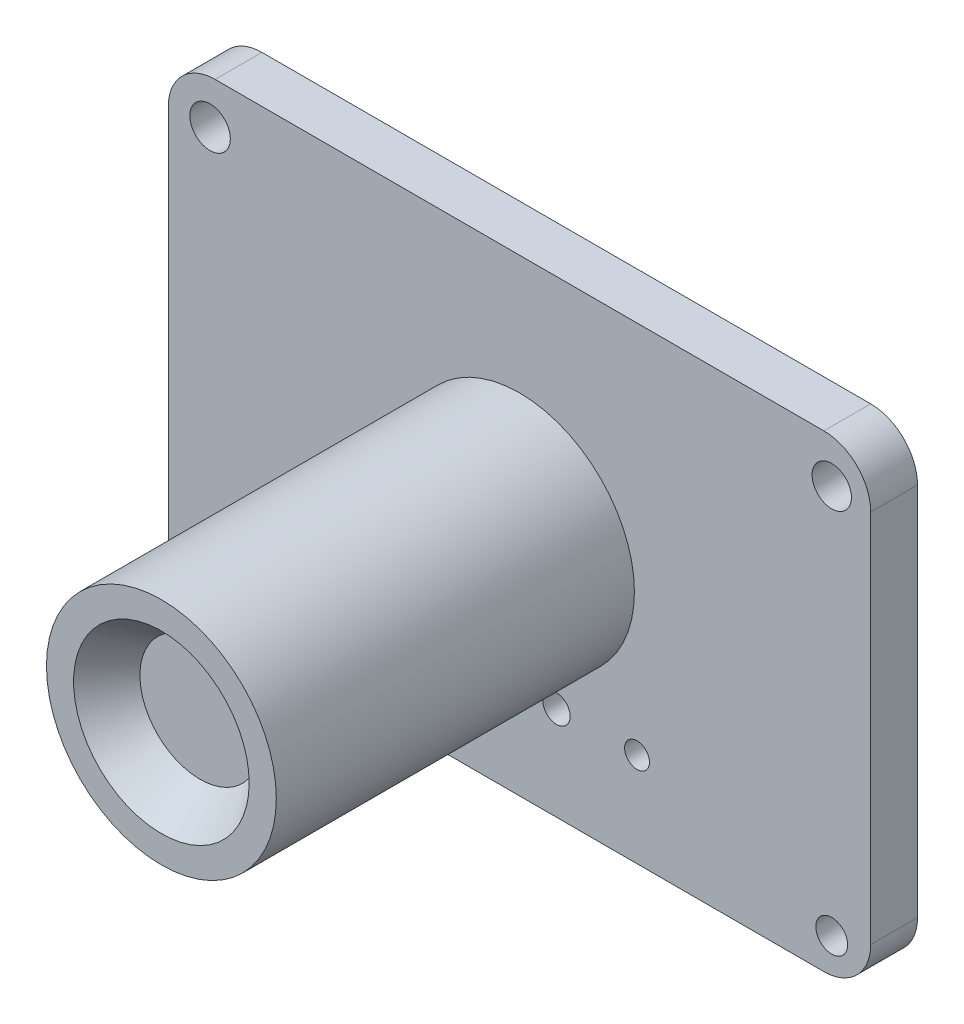
ISO-10303-21;
HEADER;
FILE_DESCRIPTION(('STEP AP214'),'2;1');
FILE_NAME('part.step','',(''),(''),'','','');
FILE_SCHEMA(('AUTOMOTIVE_DESIGN { 1 0 10303 214 1 1 1 1 }'));
ENDSEC;
DATA;
#1=APPLICATION_CONTEXT('core data for automotive mechanical design processes');
#2=APPLICATION_PROTOCOL_DEFINITION('international standard','automotive_design',2000,#1);
#3=PRODUCT_CONTEXT('',#1,'mechanical');
#4=PRODUCT('Part','Part','',(#3));
#5=PRODUCT_RELATED_PRODUCT_CATEGORY('part','',(#4));
#6=PRODUCT_DEFINITION_FORMATION('','',#4);
#7=PRODUCT_DEFINITION_CONTEXT('part definition',#1,'design');
#8=PRODUCT_DEFINITION('design','',#6,#7);
#9=PRODUCT_DEFINITION_SHAPE('','',#8);
#10=(LENGTH_UNIT() NAMED_UNIT(*) SI_UNIT(.MILLI.,.METRE.));
#11=(NAMED_UNIT(*) PLANE_ANGLE_UNIT() SI_UNIT($,.RADIAN.));
#12=(NAMED_UNIT(*) SI_UNIT($,.STERADIAN.) SOLID_ANGLE_UNIT());
#13=UNCERTAINTY_MEASURE_WITH_UNIT(LENGTH_MEASURE(1.E-05),#10,'distance_accuracy_value','');
#14=(GEOMETRIC_REPRESENTATION_CONTEXT(3) GLOBAL_UNCERTAINTY_ASSIGNED_CONTEXT((#13)) GLOBAL_UNIT_ASSIGNED_CONTEXT((#10,
#11,#12)) REPRESENTATION_CONTEXT('',''));
#15=CARTESIAN_POINT('',(0.,0.,0.));
#16=DIRECTION('',(0.,0.,1.));
#17=DIRECTION('',(1.,0.,0.));
#18=AXIS2_PLACEMENT_3D('',#15,#16,#17);
#19=CARTESIAN_POINT('',(6.5,4.,1.));
#20=DIRECTION('',(0.,0.,-1.));
#21=DIRECTION('',(-1.,0.,0.));
#22=AXIS2_PLACEMENT_3D('',#19,#20,#21);
#23=CYLINDRICAL_SURFACE('',#22,1.);
#24=CARTESIAN_POINT('',(6.5,4.,0.));
#25=DIRECTION('',(0.,0.,1.));
#26=DIRECTION('',(-1.,0.,0.));
#27=AXIS2_PLACEMENT_3D('',#24,#25,#26);
#28=CIRCLE('',#27,1.);
#29=CARTESIAN_POINT('',(7.5,3.99999999999999,0.));
#30=VERTEX_POINT('',#29);
#31=CARTESIAN_POINT('',(6.49999999999999,5.,0.));
#32=VERTEX_POINT('',#31);
#33=EDGE_CURVE('E153',#30,#32,#28,.T.);
#34=ORIENTED_EDGE('',*,*,#33,.T.);
#35=DIRECTION('',(0.,0.,-1.));
#36=VECTOR('',#35,1.);
#37=CARTESIAN_POINT('',(6.49999999999999,5.,1.));
#38=LINE('',#37,#36);
#39=CARTESIAN_POINT('',(6.49999999999999,5.,1.));
#40=VERTEX_POINT('',#39);
#41=EDGE_CURVE('E60',#40,#32,#38,.T.);
#42=ORIENTED_EDGE('',*,*,#41,.F.);
#43=CARTESIAN_POINT('',(6.5,4.,1.));
#44=DIRECTION('',(0.,0.,1.));
#45=DIRECTION('',(-1.,0.,0.));
#46=AXIS2_PLACEMENT_3D('',#43,#44,#45);
#47=CIRCLE('',#46,1.);
#48=CARTESIAN_POINT('',(7.5,3.99999999999999,1.));
#49=VERTEX_POINT('',#48);
#50=EDGE_CURVE('E176',#49,#40,#47,.T.);
#51=ORIENTED_EDGE('',*,*,#50,.F.);
#52=DIRECTION('',(0.,0.,-1.));
#53=VECTOR('',#52,1.);
#54=CARTESIAN_POINT('',(7.5,3.99999999999999,1.));
#55=LINE('',#54,#53);
#56=EDGE_CURVE('E149',#49,#30,#55,.T.);
#57=ORIENTED_EDGE('',*,*,#56,.T.);
#58=EDGE_LOOP('',(#34,#42,#51,#57));
#59=FACE_BOUND('',#58,.T.);
#60=ADVANCED_FACE('F51',(#59),#23,.T.);
#61=CARTESIAN_POINT('',(-6.49999999999999,5.,1.));
#62=DIRECTION('',(0.,-1.,0.));
#63=DIRECTION('',(0.,0.,-1.));
#64=AXIS2_PLACEMENT_3D('',#61,#62,#63);
#65=PLANE('',#64);
#66=DIRECTION('',(-1.,0.,0.));
#67=VECTOR('',#66,1.);
#68=CARTESIAN_POINT('',(-6.49999999999999,5.,0.));
#69=LINE('',#68,#67);
#70=CARTESIAN_POINT('',(-6.49999999999999,5.,0.));
#71=VERTEX_POINT('',#70);
#72=EDGE_CURVE('E157',#32,#71,#69,.T.);
#73=ORIENTED_EDGE('',*,*,#72,.T.);
#74=DIRECTION('',(0.,0.,-1.));
#75=VECTOR('',#74,1.);
#76=CARTESIAN_POINT('',(-6.49999999999999,5.,1.));
#77=LINE('',#76,#75);
#78=CARTESIAN_POINT('',(-6.49999999999999,5.,1.));
#79=VERTEX_POINT('',#78);
#80=EDGE_CURVE('E191',#79,#71,#77,.T.);
#81=ORIENTED_EDGE('',*,*,#80,.F.);
#82=DIRECTION('',(-1.,0.,0.));
#83=VECTOR('',#82,1.);
#84=CARTESIAN_POINT('',(-6.49999999999999,5.,1.));
#85=LINE('',#84,#83);
#86=EDGE_CURVE('E112',#40,#79,#85,.T.);
#87=ORIENTED_EDGE('',*,*,#86,.F.);
#88=ORIENTED_EDGE('',*,*,#41,.T.);
#89=EDGE_LOOP('',(#73,#81,#87,#88));
#90=FACE_BOUND('',#89,.T.);
#91=ADVANCED_FACE('F196',(#90),#65,.F.);
#92=CARTESIAN_POINT('',(-6.5,4.,1.));
#93=DIRECTION('',(0.,0.,-1.));
#94=DIRECTION('',(-1.,0.,0.));
#95=AXIS2_PLACEMENT_3D('',#92,#93,#94);
#96=CYLINDRICAL_SURFACE('',#95,1.);
#97=CARTESIAN_POINT('',(-6.5,4.,0.));
#98=DIRECTION('',(0.,0.,1.));
#99=DIRECTION('',(-1.,0.,0.));
#100=AXIS2_PLACEMENT_3D('',#97,#98,#99);
#101=CIRCLE('',#100,1.);
#102=CARTESIAN_POINT('',(-7.5,3.99999999999999,0.));
#103=VERTEX_POINT('',#102);
#104=EDGE_CURVE('E161',#71,#103,#101,.T.);
#105=ORIENTED_EDGE('',*,*,#104,.T.);
#106=DIRECTION('',(0.,0.,-1.));
#107=VECTOR('',#106,1.);
#108=CARTESIAN_POINT('',(-7.5,3.99999999999999,1.));
#109=LINE('',#108,#107);
#110=CARTESIAN_POINT('',(-7.5,3.99999999999999,1.));
#111=VERTEX_POINT('',#110);
#112=EDGE_CURVE('E187',#111,#103,#109,.T.);
#113=ORIENTED_EDGE('',*,*,#112,.F.);
#114=CARTESIAN_POINT('',(-6.5,4.,1.));
#115=DIRECTION('',(0.,0.,1.));
#116=DIRECTION('',(-1.,0.,0.));
#117=AXIS2_PLACEMENT_3D('',#114,#115,#116);
#118=CIRCLE('',#117,1.);
#119=EDGE_CURVE('E215',#79,#111,#118,.T.);
#120=ORIENTED_EDGE('',*,*,#119,.F.);
#121=ORIENTED_EDGE('',*,*,#80,.T.);
#122=EDGE_LOOP('',(#105,#113,#120,#121));
#123=FACE_BOUND('',#122,.T.);
#124=ADVANCED_FACE('F207',(#123),#96,.T.);
#125=CARTESIAN_POINT('',(-7.5,-3.99999999999999,1.));
#126=DIRECTION('',(1.,0.,0.));
#127=DIRECTION('',(0.,0.,-1.));
#128=AXIS2_PLACEMENT_3D('',#125,#126,#127);
#129=PLANE('',#128);
#130=DIRECTION('',(0.,-1.,0.));
#131=VECTOR('',#130,1.);
#132=CARTESIAN_POINT('',(-7.5,-3.99999999999999,0.));
#133=LINE('',#132,#131);
#134=CARTESIAN_POINT('',(-7.5,-3.99999999999999,0.));
#135=VERTEX_POINT('',#134);
#136=EDGE_CURVE('E164',#103,#135,#133,.T.);
#137=ORIENTED_EDGE('',*,*,#136,.T.);
#138=DIRECTION('',(0.,0.,-1.));
#139=VECTOR('',#138,1.);
#140=CARTESIAN_POINT('',(-7.5,-3.99999999999999,1.));
#141=LINE('',#140,#139);
#142=CARTESIAN_POINT('',(-7.5,-3.99999999999999,1.));
#143=VERTEX_POINT('',#142);
#144=EDGE_CURVE('E183',#143,#135,#141,.T.);
#145=ORIENTED_EDGE('',*,*,#144,.F.);
#146=DIRECTION('',(0.,-1.,0.));
#147=VECTOR('',#146,1.);
#148=CARTESIAN_POINT('',(-7.5,-3.99999999999999,1.));
#149=LINE('',#148,#147);
#150=EDGE_CURVE('E213',#111,#143,#149,.T.);
#151=ORIENTED_EDGE('',*,*,#150,.F.);
#152=ORIENTED_EDGE('',*,*,#112,.T.);
#153=EDGE_LOOP('',(#137,#145,#151,#152));
#154=FACE_BOUND('',#153,.T.);
#155=ADVANCED_FACE('F211',(#154),#129,.F.);
#156=CARTESIAN_POINT('',(-6.5,-4.,1.));
#157=DIRECTION('',(0.,0.,-1.));
#158=DIRECTION('',(-1.,0.,0.));
#159=AXIS2_PLACEMENT_3D('',#156,#157,#158);
#160=CYLINDRICAL_SURFACE('',#159,1.);
#161=CARTESIAN_POINT('',(-6.5,-4.,0.));
#162=DIRECTION('',(0.,0.,1.));
#163=DIRECTION('',(-1.,0.,0.));
#164=AXIS2_PLACEMENT_3D('',#161,#162,#163);
#165=CIRCLE('',#164,1.);
#166=CARTESIAN_POINT('',(-6.49999999999999,-5.,0.));
#167=VERTEX_POINT('',#166);
#168=EDGE_CURVE('E167',#135,#167,#165,.T.);
#169=ORIENTED_EDGE('',*,*,#168,.T.);
#170=DIRECTION('',(0.,0.,-1.));
#171=VECTOR('',#170,1.);
#172=CARTESIAN_POINT('',(-6.49999999999999,-5.,1.));
#173=LINE('',#172,#171);
#174=CARTESIAN_POINT('',(-6.49999999999999,-5.,1.));
#175=VERTEX_POINT('',#174);
#176=EDGE_CURVE('E142',#175,#167,#173,.T.);
#177=ORIENTED_EDGE('',*,*,#176,.F.);
#178=CARTESIAN_POINT('',(-6.5,-4.,1.));
#179=DIRECTION('',(0.,0.,1.));
#180=DIRECTION('',(-1.,0.,0.));
#181=AXIS2_PLACEMENT_3D('',#178,#179,#180);
#182=CIRCLE('',#181,1.);
#183=EDGE_CURVE('E131',#143,#175,#182,.T.);
#184=ORIENTED_EDGE('',*,*,#183,.F.);
#185=ORIENTED_EDGE('',*,*,#144,.T.);
#186=EDGE_LOOP('',(#169,#177,#184,#185));
#187=FACE_BOUND('',#186,.T.);
#188=ADVANCED_FACE('F332',(#187),#160,.T.);
#189=CARTESIAN_POINT('',(-6.49999999999999,-5.,1.));
#190=DIRECTION('',(0.,1.,0.));
#191=DIRECTION('',(0.,0.,1.));
#192=AXIS2_PLACEMENT_3D('',#189,#190,#191);
#193=PLANE('',#192);
#194=DIRECTION('',(1.,0.,0.));
#195=VECTOR('',#194,1.);
#196=CARTESIAN_POINT('',(-6.49999999999999,-5.,0.));
#197=LINE('',#196,#195);
#198=CARTESIAN_POINT('',(6.49999999999999,-5.,0.));
#199=VERTEX_POINT('',#198);
#200=EDGE_CURVE('E140',#167,#199,#197,.T.);
#201=ORIENTED_EDGE('',*,*,#200,.T.);
#202=DIRECTION('',(0.,0.,-1.));
#203=VECTOR('',#202,1.);
#204=CARTESIAN_POINT('',(6.49999999999999,-5.,1.));
#205=LINE('',#204,#203);
#206=CARTESIAN_POINT('',(6.49999999999999,-5.,1.));
#207=VERTEX_POINT('',#206);
#208=EDGE_CURVE('E137',#207,#199,#205,.T.);
#209=ORIENTED_EDGE('',*,*,#208,.F.);
#210=DIRECTION('',(1.,0.,0.));
#211=VECTOR('',#210,1.);
#212=CARTESIAN_POINT('',(-6.49999999999999,-5.,1.));
#213=LINE('',#212,#211);
#214=EDGE_CURVE('E125',#175,#207,#213,.T.);
#215=ORIENTED_EDGE('',*,*,#214,.F.);
#216=ORIENTED_EDGE('',*,*,#176,.T.);
#217=EDGE_LOOP('',(#201,#209,#215,#216));
#218=FACE_BOUND('',#217,.T.);
#219=ADVANCED_FACE('F138',(#218),#193,.F.);
#220=CARTESIAN_POINT('',(6.5,-4.,1.));
#221=DIRECTION('',(0.,0.,-1.));
#222=DIRECTION('',(-1.,0.,0.));
#223=AXIS2_PLACEMENT_3D('',#220,#221,#222);
#224=CYLINDRICAL_SURFACE('',#223,1.);
#225=CARTESIAN_POINT('',(6.5,-4.,0.));
#226=DIRECTION('',(0.,0.,1.));
#227=DIRECTION('',(1.,0.,0.));
#228=AXIS2_PLACEMENT_3D('',#225,#226,#227);
#229=CIRCLE('',#228,1.);
#230=CARTESIAN_POINT('',(7.5,-4.,0.));
#231=VERTEX_POINT('',#230);
#232=EDGE_CURVE('E97',#199,#231,#229,.T.);
#233=ORIENTED_EDGE('',*,*,#232,.T.);
#234=DIRECTION('',(0.,0.,-1.));
#235=VECTOR('',#234,1.);
#236=CARTESIAN_POINT('',(7.5,-4.,1.));
#237=LINE('',#236,#235);
#238=CARTESIAN_POINT('',(7.5,-4.,1.));
#239=VERTEX_POINT('',#238);
#240=EDGE_CURVE('E143',#239,#231,#237,.T.);
#241=ORIENTED_EDGE('',*,*,#240,.F.);
#242=CARTESIAN_POINT('',(6.5,-4.,1.));
#243=DIRECTION('',(0.,0.,1.));
#244=DIRECTION('',(1.,0.,0.));
#245=AXIS2_PLACEMENT_3D('',#242,#243,#244);
#246=CIRCLE('',#245,1.);
#247=EDGE_CURVE('E129',#207,#239,#246,.T.);
#248=ORIENTED_EDGE('',*,*,#247,.F.);
#249=ORIENTED_EDGE('',*,*,#208,.T.);
#250=EDGE_LOOP('',(#233,#241,#248,#249));
#251=FACE_BOUND('',#250,.T.);
#252=ADVANCED_FACE('F145',(#251),#224,.T.);
#253=CARTESIAN_POINT('',(7.5,-3.99999999999999,1.));
#254=DIRECTION('',(-1.,0.,0.));
#255=DIRECTION('',(0.,0.,1.));
#256=AXIS2_PLACEMENT_3D('',#253,#254,#255);
#257=PLANE('',#256);
#258=DIRECTION('',(0.,1.,0.));
#259=VECTOR('',#258,1.);
#260=CARTESIAN_POINT('',(7.5,-3.99999999999999,0.));
#261=LINE('',#260,#259);
#262=EDGE_CURVE('E103',#231,#30,#261,.T.);
#263=ORIENTED_EDGE('',*,*,#262,.T.);
#264=ORIENTED_EDGE('',*,*,#56,.F.);
#265=DIRECTION('',(0.,1.,0.));
#266=VECTOR('',#265,1.);
#267=CARTESIAN_POINT('',(7.5,-3.99999999999999,1.));
#268=LINE('',#267,#266);
#269=EDGE_CURVE('E68',#239,#49,#268,.T.);
#270=ORIENTED_EDGE('',*,*,#269,.F.);
#271=ORIENTED_EDGE('',*,*,#240,.T.);
#272=EDGE_LOOP('',(#263,#264,#270,#271));
#273=FACE_BOUND('',#272,.T.);
#274=ADVANCED_FACE('F340',(#273),#257,.F.);
#275=CARTESIAN_POINT('',(6.5,4.,1.));
#276=DIRECTION('',(0.,0.,-1.));
#277=DIRECTION('',(-1.,0.,0.));
#278=AXIS2_PLACEMENT_3D('',#275,#276,#277);
#279=PLANE('',#278);
#280=CARTESIAN_POINT('',(0.,0.,1.));
#281=DIRECTION('',(0.,0.,-1.));
#282=DIRECTION('',(-1.,0.,0.));
#283=AXIS2_PLACEMENT_3D('',#280,#281,#282);
#284=CIRCLE('',#283,2.45391178482121);
#285=CARTESIAN_POINT('',(-2.45391178482121,0.,1.));
#286=VERTEX_POINT('',#285);
#287=EDGE_CURVE('E11',#286,#286,#284,.F.);
#288=ORIENTED_EDGE('',*,*,#287,.F.);
#289=EDGE_LOOP('',(#288));
#290=FACE_BOUND('',#289,.T.);
#291=CARTESIAN_POINT('',(-2.73997618102421,-3.03796367243005,1.));
#292=DIRECTION('',(0.,0.,1.));
#293=DIRECTION('',(1.,0.,0.));
#294=AXIS2_PLACEMENT_3D('',#291,#292,#293);
#295=CIRCLE('',#294,0.305784331729347);
#296=CARTESIAN_POINT('',(-2.43419184929487,-3.03796367243005,1.));
#297=VERTEX_POINT('',#296);
#298=EDGE_CURVE('E229',#297,#297,#295,.T.);
#299=ORIENTED_EDGE('',*,*,#298,.F.);
#300=EDGE_LOOP('',(#299));
#301=FACE_BOUND('',#300,.T.);
#302=CARTESIAN_POINT('',(-0.911075823739579,-2.99072270379171,1.));
#303=DIRECTION('',(0.,0.,1.));
#304=DIRECTION('',(1.,0.,0.));
#305=AXIS2_PLACEMENT_3D('',#302,#303,#304);
#306=CIRCLE('',#305,0.294014573627205);
#307=CARTESIAN_POINT('',(-0.617061250112374,-2.99072270379171,1.));
#308=VERTEX_POINT('',#307);
#309=EDGE_CURVE('E254',#308,#308,#306,.T.);
#310=ORIENTED_EDGE('',*,*,#309,.F.);
#311=EDGE_LOOP('',(#310));
#312=FACE_BOUND('',#311,.T.);
#313=CARTESIAN_POINT('',(0.789599047240968,-2.99072270379171,1.));
#314=DIRECTION('',(0.,0.,1.));
#315=DIRECTION('',(1.,0.,0.));
#316=AXIS2_PLACEMENT_3D('',#313,#314,#315);
#317=CIRCLE('',#316,0.292383519953464);
#318=CARTESIAN_POINT('',(1.08198256719443,-2.99072270379171,1.));
#319=VERTEX_POINT('',#318);
#320=EDGE_CURVE('E246',#319,#319,#317,.T.);
#321=ORIENTED_EDGE('',*,*,#320,.F.);
#322=EDGE_LOOP('',(#321));
#323=FACE_BOUND('',#322,.T.);
#324=CARTESIAN_POINT('',(2.51052004763795,-2.99072270379171,1.));
#325=DIRECTION('',(0.,0.,1.));
#326=DIRECTION('',(1.,0.,0.));
#327=AXIS2_PLACEMENT_3D('',#324,#325,#326);
#328=CIRCLE('',#327,0.265611248210103);
#329=CARTESIAN_POINT('',(2.77613129584806,-2.99072270379171,1.));
#330=VERTEX_POINT('',#329);
#331=EDGE_CURVE('E237',#330,#330,#328,.T.);
#332=ORIENTED_EDGE('',*,*,#331,.F.);
#333=EDGE_LOOP('',(#332));
#334=FACE_BOUND('',#333,.T.);
#335=CARTESIAN_POINT('',(6.66772528781263,-4.25273143741616,1.));
#336=DIRECTION('',(0.,0.,1.));
#337=DIRECTION('',(1.,0.,0.));
#338=AXIS2_PLACEMENT_3D('',#335,#336,#337);
#339=CIRCLE('',#338,0.339655263273913);
#340=CARTESIAN_POINT('',(7.00738055108654,-4.25273143741616,1.));
#341=VERTEX_POINT('',#340);
#342=EDGE_CURVE('E238',#341,#341,#339,.T.);
#343=ORIENTED_EDGE('',*,*,#342,.F.);
#344=EDGE_LOOP('',(#343));
#345=FACE_BOUND('',#344,.T.);
#346=CARTESIAN_POINT('',(6.66772528781263,4.06167904293318,1.));
#347=DIRECTION('',(0.,0.,1.));
#348=DIRECTION('',(1.,0.,0.));
#349=AXIS2_PLACEMENT_3D('',#346,#347,#348);
#350=CIRCLE('',#349,0.419941145158823);
#351=CARTESIAN_POINT('',(7.08766643297145,4.06167904293318,1.));
#352=VERTEX_POINT('',#351);
#353=EDGE_CURVE('E278',#352,#352,#350,.T.);
#354=ORIENTED_EDGE('',*,*,#353,.F.);
#355=EDGE_LOOP('',(#354));
#356=FACE_BOUND('',#355,.T.);
#357=CARTESIAN_POINT('',(-6.60698689956332,4.06167904293318,1.));
#358=DIRECTION('',(0.,0.,1.));
#359=DIRECTION('',(1.,0.,0.));
#360=AXIS2_PLACEMENT_3D('',#357,#358,#359);
#361=CIRCLE('',#360,0.432128273268593);
#362=CARTESIAN_POINT('',(-6.17485862629472,4.06167904293318,1.));
#363=VERTEX_POINT('',#362);
#364=EDGE_CURVE('E269',#363,#363,#361,.T.);
#365=ORIENTED_EDGE('',*,*,#364,.F.);
#366=EDGE_LOOP('',(#365));
#367=FACE_BOUND('',#366,.T.);
#368=CARTESIAN_POINT('',(-6.60698689956332,-4.25273143741616,1.));
#369=DIRECTION('',(0.,0.,1.));
#370=DIRECTION('',(1.,0.,0.));
#371=AXIS2_PLACEMENT_3D('',#368,#369,#370);
#372=CIRCLE('',#371,0.41139461869024);
#373=CARTESIAN_POINT('',(-6.19559228087308,-4.25273143741616,1.));
#374=VERTEX_POINT('',#373);
#375=EDGE_CURVE('E225',#374,#374,#372,.T.);
#376=ORIENTED_EDGE('',*,*,#375,.F.);
#377=EDGE_LOOP('',(#376));
#378=FACE_BOUND('',#377,.T.);
#379=ORIENTED_EDGE('',*,*,#50,.T.);
#380=ORIENTED_EDGE('',*,*,#86,.T.);
#381=ORIENTED_EDGE('',*,*,#119,.T.);
#382=ORIENTED_EDGE('',*,*,#150,.T.);
#383=ORIENTED_EDGE('',*,*,#183,.T.);
#384=ORIENTED_EDGE('',*,*,#214,.T.);
#385=ORIENTED_EDGE('',*,*,#247,.T.);
#386=ORIENTED_EDGE('',*,*,#269,.T.);
#387=EDGE_LOOP('',(#379,#380,#381,#382,#383,#384,#385,#386));
#388=FACE_BOUND('',#387,.T.);
#389=ADVANCED_FACE('F127',(#290,#301,#312,#323,#334,#345,#356,#367,#378,#388),#279,.F.);
#390=CARTESIAN_POINT('',(6.5,4.,0.));
#391=DIRECTION('',(0.,0.,-1.));
#392=DIRECTION('',(-1.,0.,0.));
#393=AXIS2_PLACEMENT_3D('',#390,#391,#392);
#394=PLANE('',#393);
#395=CARTESIAN_POINT('',(-2.73997618102421,-3.03796367243005,0.));
#396=DIRECTION('',(0.,0.,1.));
#397=DIRECTION('',(1.,0.,0.));
#398=AXIS2_PLACEMENT_3D('',#395,#396,#397);
#399=CIRCLE('',#398,0.305784331729347);
#400=CARTESIAN_POINT('',(-2.43419184929487,-3.03796367243005,0.));
#401=VERTEX_POINT('',#400);
#402=EDGE_CURVE('E258',#401,#401,#399,.T.);
#403=ORIENTED_EDGE('',*,*,#402,.T.);
#404=EDGE_LOOP('',(#403));
#405=FACE_BOUND('',#404,.T.);
#406=CARTESIAN_POINT('',(-0.911075823739579,-2.99072270379171,0.));
#407=DIRECTION('',(0.,0.,1.));
#408=DIRECTION('',(1.,0.,0.));
#409=AXIS2_PLACEMENT_3D('',#406,#407,#408);
#410=CIRCLE('',#409,0.294014573627205);
#411=CARTESIAN_POINT('',(-0.617061250112374,-2.99072270379171,0.));
#412=VERTEX_POINT('',#411);
#413=EDGE_CURVE('E250',#412,#412,#410,.T.);
#414=ORIENTED_EDGE('',*,*,#413,.T.);
#415=EDGE_LOOP('',(#414));
#416=FACE_BOUND('',#415,.T.);
#417=CARTESIAN_POINT('',(0.789599047240968,-2.99072270379171,0.));
#418=DIRECTION('',(0.,0.,1.));
#419=DIRECTION('',(1.,0.,0.));
#420=AXIS2_PLACEMENT_3D('',#417,#418,#419);
#421=CIRCLE('',#420,0.292383519953464);
#422=CARTESIAN_POINT('',(1.08198256719443,-2.99072270379171,0.));
#423=VERTEX_POINT('',#422);
#424=EDGE_CURVE('E242',#423,#423,#421,.T.);
#425=ORIENTED_EDGE('',*,*,#424,.T.);
#426=EDGE_LOOP('',(#425));
#427=FACE_BOUND('',#426,.T.);
#428=CARTESIAN_POINT('',(2.51052004763795,-2.99072270379171,0.));
#429=DIRECTION('',(0.,0.,1.));
#430=DIRECTION('',(1.,0.,0.));
#431=AXIS2_PLACEMENT_3D('',#428,#429,#430);
#432=CIRCLE('',#431,0.265611248210103);
#433=CARTESIAN_POINT('',(2.77613129584806,-2.99072270379171,0.));
#434=VERTEX_POINT('',#433);
#435=EDGE_CURVE('E233',#434,#434,#432,.T.);
#436=ORIENTED_EDGE('',*,*,#435,.T.);
#437=EDGE_LOOP('',(#436));
#438=FACE_BOUND('',#437,.T.);
#439=CARTESIAN_POINT('',(6.66772528781263,-4.25273143741616,0.));
#440=DIRECTION('',(0.,0.,1.));
#441=DIRECTION('',(1.,0.,0.));
#442=AXIS2_PLACEMENT_3D('',#439,#440,#441);
#443=CIRCLE('',#442,0.339655263273913);
#444=CARTESIAN_POINT('',(7.00738055108654,-4.25273143741616,0.));
#445=VERTEX_POINT('',#444);
#446=EDGE_CURVE('E282',#445,#445,#443,.T.);
#447=ORIENTED_EDGE('',*,*,#446,.T.);
#448=EDGE_LOOP('',(#447));
#449=FACE_BOUND('',#448,.T.);
#450=CARTESIAN_POINT('',(6.66772528781263,4.06167904293318,0.));
#451=DIRECTION('',(0.,0.,1.));
#452=DIRECTION('',(1.,0.,0.));
#453=AXIS2_PLACEMENT_3D('',#450,#451,#452);
#454=CIRCLE('',#453,0.419941145158823);
#455=CARTESIAN_POINT('',(7.08766643297145,4.06167904293318,0.));
#456=VERTEX_POINT('',#455);
#457=EDGE_CURVE('E274',#456,#456,#454,.T.);
#458=ORIENTED_EDGE('',*,*,#457,.T.);
#459=EDGE_LOOP('',(#458));
#460=FACE_BOUND('',#459,.T.);
#461=CARTESIAN_POINT('',(-6.60698689956332,4.06167904293318,0.));
#462=DIRECTION('',(0.,0.,1.));
#463=DIRECTION('',(1.,0.,0.));
#464=AXIS2_PLACEMENT_3D('',#461,#462,#463);
#465=CIRCLE('',#464,0.432128273268593);
#466=CARTESIAN_POINT('',(-6.17485862629472,4.06167904293318,0.));
#467=VERTEX_POINT('',#466);
#468=EDGE_CURVE('E265',#467,#467,#465,.T.);
#469=ORIENTED_EDGE('',*,*,#468,.T.);
#470=EDGE_LOOP('',(#469));
#471=FACE_BOUND('',#470,.T.);
#472=CARTESIAN_POINT('',(-6.60698689956332,-4.25273143741616,0.));
#473=DIRECTION('',(0.,0.,1.));
#474=DIRECTION('',(1.,0.,0.));
#475=AXIS2_PLACEMENT_3D('',#472,#473,#474);
#476=CIRCLE('',#475,0.41139461869024);
#477=CARTESIAN_POINT('',(-6.19559228087308,-4.25273143741616,0.));
#478=VERTEX_POINT('',#477);
#479=EDGE_CURVE('E158',#478,#478,#476,.T.);
#480=ORIENTED_EDGE('',*,*,#479,.T.);
#481=EDGE_LOOP('',(#480));
#482=FACE_BOUND('',#481,.T.);
#483=ORIENTED_EDGE('',*,*,#33,.F.);
#484=ORIENTED_EDGE('',*,*,#262,.F.);
#485=ORIENTED_EDGE('',*,*,#232,.F.);
#486=ORIENTED_EDGE('',*,*,#200,.F.);
#487=ORIENTED_EDGE('',*,*,#168,.F.);
#488=ORIENTED_EDGE('',*,*,#136,.F.);
#489=ORIENTED_EDGE('',*,*,#104,.F.);
#490=ORIENTED_EDGE('',*,*,#72,.F.);
#491=EDGE_LOOP('',(#483,#484,#485,#486,#487,#488,#489,#490));
#492=FACE_BOUND('',#491,.T.);
#493=ADVANCED_FACE('F201',(#405,#416,#427,#438,#449,#460,#471,#482,#492),#394,.T.);
#494=CARTESIAN_POINT('',(-6.60698689956332,-4.25273143741616,0.));
#495=DIRECTION('',(0.,0.,1.));
#496=DIRECTION('',(1.,0.,0.));
#497=AXIS2_PLACEMENT_3D('',#494,#495,#496);
#498=CYLINDRICAL_SURFACE('',#497,0.41139461869024);
#499=ORIENTED_EDGE('',*,*,#479,.F.);
#500=EDGE_LOOP('',(#499));
#501=FACE_BOUND('',#500,.T.);
#502=ORIENTED_EDGE('',*,*,#375,.T.);
#503=EDGE_LOOP('',(#502));
#504=FACE_BOUND('',#503,.T.);
#505=ADVANCED_FACE('F344',(#501,#504),#498,.F.);
#506=CARTESIAN_POINT('',(-6.60698689956332,4.06167904293318,0.));
#507=DIRECTION('',(0.,0.,1.));
#508=DIRECTION('',(1.,0.,0.));
#509=AXIS2_PLACEMENT_3D('',#506,#507,#508);
#510=CYLINDRICAL_SURFACE('',#509,0.432128273268593);
#511=ORIENTED_EDGE('',*,*,#468,.F.);
#512=EDGE_LOOP('',(#511));
#513=FACE_BOUND('',#512,.T.);
#514=ORIENTED_EDGE('',*,*,#364,.T.);
#515=EDGE_LOOP('',(#514));
#516=FACE_BOUND('',#515,.T.);
#517=ADVANCED_FACE('F351',(#513,#516),#510,.F.);
#518=CARTESIAN_POINT('',(6.66772528781263,4.06167904293318,0.));
#519=DIRECTION('',(0.,0.,1.));
#520=DIRECTION('',(1.,0.,0.));
#521=AXIS2_PLACEMENT_3D('',#518,#519,#520);
#522=CYLINDRICAL_SURFACE('',#521,0.419941145158823);
#523=ORIENTED_EDGE('',*,*,#457,.F.);
#524=EDGE_LOOP('',(#523));
#525=FACE_BOUND('',#524,.T.);
#526=ORIENTED_EDGE('',*,*,#353,.T.);
#527=EDGE_LOOP('',(#526));
#528=FACE_BOUND('',#527,.T.);
#529=ADVANCED_FACE('F367',(#525,#528),#522,.F.);
#530=CARTESIAN_POINT('',(6.66772528781263,-4.25273143741616,0.));
#531=DIRECTION('',(0.,0.,1.));
#532=DIRECTION('',(1.,0.,0.));
#533=AXIS2_PLACEMENT_3D('',#530,#531,#532);
#534=CYLINDRICAL_SURFACE('',#533,0.339655263273913);
#535=ORIENTED_EDGE('',*,*,#446,.F.);
#536=EDGE_LOOP('',(#535));
#537=FACE_BOUND('',#536,.T.);
#538=ORIENTED_EDGE('',*,*,#342,.T.);
#539=EDGE_LOOP('',(#538));
#540=FACE_BOUND('',#539,.T.);
#541=ADVANCED_FACE('F357',(#537,#540),#534,.F.);
#542=CARTESIAN_POINT('',(2.51052004763795,-2.99072270379171,0.));
#543=DIRECTION('',(0.,0.,1.));
#544=DIRECTION('',(1.,0.,0.));
#545=AXIS2_PLACEMENT_3D('',#542,#543,#544);
#546=CYLINDRICAL_SURFACE('',#545,0.265611248210103);
#547=ORIENTED_EDGE('',*,*,#435,.F.);
#548=EDGE_LOOP('',(#547));
#549=FACE_BOUND('',#548,.T.);
#550=ORIENTED_EDGE('',*,*,#331,.T.);
#551=EDGE_LOOP('',(#550));
#552=FACE_BOUND('',#551,.T.);
#553=ADVANCED_FACE('F353',(#549,#552),#546,.F.);
#554=CARTESIAN_POINT('',(0.789599047240968,-2.99072270379171,0.));
#555=DIRECTION('',(0.,0.,1.));
#556=DIRECTION('',(1.,0.,0.));
#557=AXIS2_PLACEMENT_3D('',#554,#555,#556);
#558=CYLINDRICAL_SURFACE('',#557,0.292383519953464);
#559=ORIENTED_EDGE('',*,*,#424,.F.);
#560=EDGE_LOOP('',(#559));
#561=FACE_BOUND('',#560,.T.);
#562=ORIENTED_EDGE('',*,*,#320,.T.);
#563=EDGE_LOOP('',(#562));
#564=FACE_BOUND('',#563,.T.);
#565=ADVANCED_FACE('F356',(#561,#564),#558,.F.);
#566=CARTESIAN_POINT('',(-0.911075823739579,-2.99072270379171,0.));
#567=DIRECTION('',(0.,0.,1.));
#568=DIRECTION('',(1.,0.,0.));
#569=AXIS2_PLACEMENT_3D('',#566,#567,#568);
#570=CYLINDRICAL_SURFACE('',#569,0.294014573627205);
#571=ORIENTED_EDGE('',*,*,#413,.F.);
#572=EDGE_LOOP('',(#571));
#573=FACE_BOUND('',#572,.T.);
#574=ORIENTED_EDGE('',*,*,#309,.T.);
#575=EDGE_LOOP('',(#574));
#576=FACE_BOUND('',#575,.T.);
#577=ADVANCED_FACE('F317',(#573,#576),#570,.F.);
#578=CARTESIAN_POINT('',(-2.73997618102421,-3.03796367243005,0.));
#579=DIRECTION('',(0.,0.,1.));
#580=DIRECTION('',(1.,0.,0.));
#581=AXIS2_PLACEMENT_3D('',#578,#579,#580);
#582=CYLINDRICAL_SURFACE('',#581,0.305784331729347);
#583=ORIENTED_EDGE('',*,*,#402,.F.);
#584=EDGE_LOOP('',(#583));
#585=FACE_BOUND('',#584,.T.);
#586=ORIENTED_EDGE('',*,*,#298,.T.);
#587=EDGE_LOOP('',(#586));
#588=FACE_BOUND('',#587,.T.);
#589=ADVANCED_FACE('F306',(#585,#588),#582,.F.);
#590=CARTESIAN_POINT('',(0.,0.,5.));
#591=DIRECTION('',(0.,0.,-1.));
#592=DIRECTION('',(-1.,0.,0.));
#593=AXIS2_PLACEMENT_3D('',#590,#591,#592);
#594=CYLINDRICAL_SURFACE('',#593,2.45391178482121);
#595=ORIENTED_EDGE('',*,*,#287,.T.);
#596=EDGE_LOOP('',(#595));
#597=FACE_BOUND('',#596,.T.);
#598=CARTESIAN_POINT('',(0.,0.,8.64701601164483));
#599=DIRECTION('',(0.,0.,1.));
#600=DIRECTION('',(1.,0.,0.));
#601=AXIS2_PLACEMENT_3D('',#598,#599,#600);
#602=CIRCLE('',#601,2.45391178482121);
#603=CARTESIAN_POINT('',(2.45391178482121,0.,8.64701601164483));
#604=VERTEX_POINT('',#603);
#605=EDGE_CURVE('E296',#604,#604,#602,.T.);
#606=ORIENTED_EDGE('',*,*,#605,.F.);
#607=EDGE_LOOP('',(#606));
#608=FACE_BOUND('',#607,.T.);
#609=ADVANCED_FACE('F303',(#597,#608),#594,.T.);
#610=CARTESIAN_POINT('',(0.,1.28093158660844,7.82350800582242));
#611=DIRECTION('',(0.,0.,-1.));
#612=DIRECTION('',(-1.,0.,0.));
#613=AXIS2_PLACEMENT_3D('',#610,#611,#612);
#614=PLANE('',#613);
#615=CARTESIAN_POINT('',(0.,0.,7.82350800582242));
#616=DIRECTION('',(0.,0.,1.));
#617=DIRECTION('',(1.,0.,0.));
#618=AXIS2_PLACEMENT_3D('',#615,#616,#617);
#619=CIRCLE('',#618,1.28093158660844);
#620=CARTESIAN_POINT('',(1.28093158660844,0.,7.82350800582242));
#621=VERTEX_POINT('',#620);
#622=EDGE_CURVE('E270',#621,#621,#619,.T.);
#623=ORIENTED_EDGE('',*,*,#622,.T.);
#624=EDGE_LOOP('',(#623));
#625=FACE_BOUND('',#624,.T.);
#626=ADVANCED_FACE('F305',(#625),#614,.F.);
#627=CARTESIAN_POINT('',(0.,0.,8.64701601164483));
#628=DIRECTION('',(0.,0.,1.));
#629=DIRECTION('',(1.,0.,0.));
#630=AXIS2_PLACEMENT_3D('',#627,#628,#629);
#631=CONICAL_SURFACE('',#630,1.87481804949054,0.624790932198965);
#632=ORIENTED_EDGE('',*,*,#622,.F.);
#633=EDGE_LOOP('',(#632));
#634=FACE_BOUND('',#633,.T.);
#635=CARTESIAN_POINT('',(0.,0.,8.64701601164483));
#636=DIRECTION('',(0.,0.,1.));
#637=DIRECTION('',(1.,0.,0.));
#638=AXIS2_PLACEMENT_3D('',#635,#636,#637);
#639=CIRCLE('',#638,1.87481804949054);
#640=CARTESIAN_POINT('',(1.87481804949054,0.,8.64701601164483));
#641=VERTEX_POINT('',#640);
#642=EDGE_CURVE('E292',#641,#641,#639,.T.);
#643=ORIENTED_EDGE('',*,*,#642,.T.);
#644=EDGE_LOOP('',(#643));
#645=FACE_BOUND('',#644,.T.);
#646=ADVANCED_FACE('F313',(#634,#645),#631,.F.);
#647=CARTESIAN_POINT('',(0.,2.45391178482121,8.64701601164483));
#648=DIRECTION('',(0.,0.,-1.));
#649=DIRECTION('',(-1.,0.,0.));
#650=AXIS2_PLACEMENT_3D('',#647,#648,#649);
#651=PLANE('',#650);
#652=ORIENTED_EDGE('',*,*,#642,.F.);
#653=EDGE_LOOP('',(#652));
#654=FACE_BOUND('',#653,.T.);
#655=ORIENTED_EDGE('',*,*,#605,.T.);
#656=EDGE_LOOP('',(#655));
#657=FACE_BOUND('',#656,.T.);
#658=ADVANCED_FACE('F301',(#654,#657),#651,.F.);
#659=CLOSED_SHELL('',(#60,#91,#124,#155,#188,#219,#252,#274,#389,#493,#505,#517,#529,#541,#553,
#565,#577,#589,#609,#626,#646,#658));
#660=MANIFOLD_SOLID_BREP('B2',#659);
#661=ADVANCED_BREP_SHAPE_REPRESENTATION('',(#18,#660),#14);
#662=SHAPE_DEFINITION_REPRESENTATION(#9,#661);
ENDSEC;
END-ISO-10303-21;
